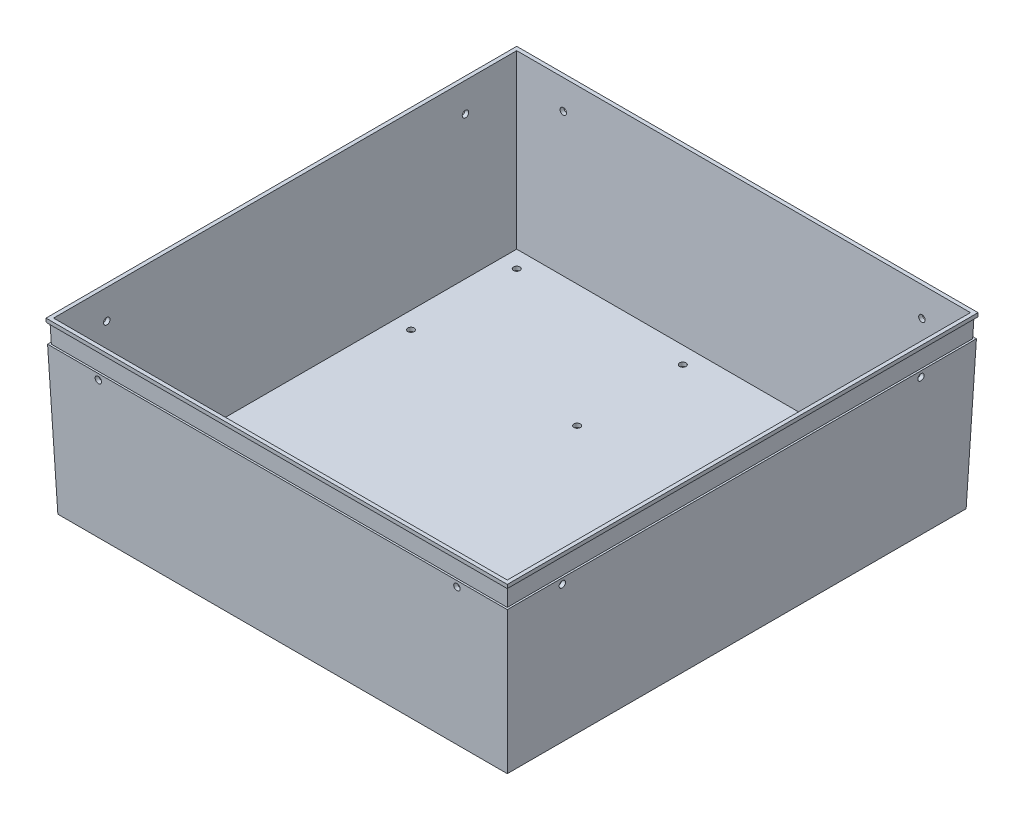
ISO-10303-21;
HEADER;
FILE_DESCRIPTION(('STEP AP214'),'2;1');
FILE_NAME('part.step','',(''),(''),'','','');
FILE_SCHEMA(('AUTOMOTIVE_DESIGN { 1 0 10303 214 1 1 1 1 }'));
ENDSEC;
DATA;
#1=APPLICATION_CONTEXT('core data for automotive mechanical design processes');
#2=APPLICATION_PROTOCOL_DEFINITION('international standard','automotive_design',2000,#1);
#3=PRODUCT_CONTEXT('',#1,'mechanical');
#4=PRODUCT('Part','Part','',(#3));
#5=PRODUCT_RELATED_PRODUCT_CATEGORY('part','',(#4));
#6=PRODUCT_DEFINITION_FORMATION('','',#4);
#7=PRODUCT_DEFINITION_CONTEXT('part definition',#1,'design');
#8=PRODUCT_DEFINITION('design','',#6,#7);
#9=PRODUCT_DEFINITION_SHAPE('','',#8);
#10=(LENGTH_UNIT() NAMED_UNIT(*) SI_UNIT(.MILLI.,.METRE.));
#11=(NAMED_UNIT(*) PLANE_ANGLE_UNIT() SI_UNIT($,.RADIAN.));
#12=(NAMED_UNIT(*) SI_UNIT($,.STERADIAN.) SOLID_ANGLE_UNIT());
#13=UNCERTAINTY_MEASURE_WITH_UNIT(LENGTH_MEASURE(1.E-05),#10,'distance_accuracy_value','');
#14=(GEOMETRIC_REPRESENTATION_CONTEXT(3) GLOBAL_UNCERTAINTY_ASSIGNED_CONTEXT((#13)) GLOBAL_UNIT_ASSIGNED_CONTEXT((#10,
#11,#12)) REPRESENTATION_CONTEXT('',''));
#15=CARTESIAN_POINT('',(0.,0.,0.));
#16=DIRECTION('',(0.,0.,1.));
#17=DIRECTION('',(1.,0.,0.));
#18=AXIS2_PLACEMENT_3D('',#15,#16,#17);
#19=CARTESIAN_POINT('',(-119.05,0.,-121.55));
#20=DIRECTION('',(0.,-0.034899496702501,-0.999390827019096));
#21=DIRECTION('',(0.,0.999390827019096,-0.034899496702501));
#22=AXIS2_PLACEMENT_3D('',#19,#20,#21);
#23=PLANE('',#22);
#24=DIRECTION('',(-0.0348782627423747,-0.998782765958718,0.0348782627423747));
#25=VECTOR('',#24,1.);
#26=CARTESIAN_POINT('',(118.76035296624,-8.29440582138538,-121.26035296624));
#27=LINE('',#26,#25);
#28=CARTESIAN_POINT('',(122.192869254257,90.,-124.692869254257));
#29=VERTEX_POINT('',#28);
#30=CARTESIAN_POINT('',(122.123070260852,88.0012183459618,-124.623070260852));
#31=VERTEX_POINT('',#30);
#32=EDGE_CURVE('E261',#29,#31,#27,.T.);
#33=ORIENTED_EDGE('',*,*,#32,.T.);
#34=DIRECTION('',(1.,0.,0.));
#35=VECTOR('',#34,1.);
#36=CARTESIAN_POINT('',(-119.05,88.0012183459618,-124.623070260852));
#37=LINE('',#36,#35);
#38=CARTESIAN_POINT('',(-122.123070260852,88.0012183459618,-124.623070260852));
#39=VERTEX_POINT('',#38);
#40=EDGE_CURVE('E198',#31,#39,#37,.F.);
#41=ORIENTED_EDGE('',*,*,#40,.T.);
#42=DIRECTION('',(0.0348782627423747,-0.998782765958718,0.0348782627423747));
#43=VECTOR('',#42,1.);
#44=CARTESIAN_POINT('',(-118.754270500181,-8.4685848600537,-121.254270500181));
#45=LINE('',#44,#43);
#46=CARTESIAN_POINT('',(-122.192869254257,90.,-124.692869254257));
#47=VERTEX_POINT('',#46);
#48=EDGE_CURVE('E277',#47,#39,#45,.T.);
#49=ORIENTED_EDGE('',*,*,#48,.F.);
#50=DIRECTION('',(1.,0.,0.));
#51=VECTOR('',#50,1.);
#52=CARTESIAN_POINT('',(0.,90.,-124.692869254257));
#53=LINE('',#52,#51);
#54=EDGE_CURVE('E284',#29,#47,#53,.F.);
#55=ORIENTED_EDGE('',*,*,#54,.F.);
#56=EDGE_LOOP('',(#33,#41,#49,#55));
#57=FACE_BOUND('',#56,.T.);
#58=ADVANCED_FACE('F45',(#57),#23,.T.);
#59=CARTESIAN_POINT('',(-95.,74.9393386013086,-124.16693936916));
#60=DIRECTION('',(0.,0.0348994967025011,0.999390827019096));
#61=DIRECTION('',(0.,-0.999390827019096,0.0348994967025011));
#62=AXIS2_PLACEMENT_3D('',#59,#60,#61);
#63=CIRCLE('',#62,1.7);
#64=CARTESIAN_POINT('',(-95.,73.2403741953761,-124.107610224766));
#65=VERTEX_POINT('',#64);
#66=EDGE_CURVE('E308',#65,#65,#63,.T.);
#67=ORIENTED_EDGE('',*,*,#66,.T.);
#68=EDGE_LOOP('',(#67));
#69=FACE_BOUND('',#68,.T.);
#70=CARTESIAN_POINT('',(95.,74.9393386013086,-124.16693936916));
#71=DIRECTION('',(0.,0.0348994967025011,0.999390827019096));
#72=DIRECTION('',(0.,0.999390827019096,-0.0348994967025011));
#73=AXIS2_PLACEMENT_3D('',#70,#71,#72);
#74=CIRCLE('',#73,1.7);
#75=CARTESIAN_POINT('',(95.,76.638303007241,-124.226268513555));
#76=VERTEX_POINT('',#75);
#77=EDGE_CURVE('E321',#76,#76,#74,.T.);
#78=ORIENTED_EDGE('',*,*,#77,.T.);
#79=EDGE_LOOP('',(#78));
#80=FACE_BOUND('',#79,.T.);
#81=DIRECTION('',(-1.,0.,0.));
#82=VECTOR('',#81,1.);
#83=CARTESIAN_POINT('',(-119.05,78.0133906863746,-124.274287633429));
#84=LINE('',#83,#82);
#85=CARTESIAN_POINT('',(-121.774287633429,78.0133906863746,-124.274287633429));
#86=VERTEX_POINT('',#85);
#87=CARTESIAN_POINT('',(121.774287633429,78.0133906863746,-124.274287633429));
#88=VERTEX_POINT('',#87);
#89=EDGE_CURVE('E187',#86,#88,#84,.F.);
#90=ORIENTED_EDGE('',*,*,#89,.T.);
#91=CARTESIAN_POINT('',(119.05,0.,-121.55));
#92=VERTEX_POINT('',#91);
#93=EDGE_CURVE('E265',#88,#92,#27,.T.);
#94=ORIENTED_EDGE('',*,*,#93,.T.);
#95=DIRECTION('',(-1.,0.,0.));
#96=VECTOR('',#95,1.);
#97=CARTESIAN_POINT('',(-119.05,0.,-121.55));
#98=LINE('',#97,#96);
#99=CARTESIAN_POINT('',(-119.05,0.,-121.55));
#100=VERTEX_POINT('',#99);
#101=EDGE_CURVE('E248',#92,#100,#98,.T.);
#102=ORIENTED_EDGE('',*,*,#101,.T.);
#103=EDGE_CURVE('E276',#86,#100,#45,.T.);
#104=ORIENTED_EDGE('',*,*,#103,.F.);
#105=EDGE_LOOP('',(#90,#94,#102,#104));
#106=FACE_BOUND('',#105,.T.);
#107=ADVANCED_FACE('F406',(#69,#80,#106),#23,.T.);
#108=CARTESIAN_POINT('',(-120.773678831314,78.0133906863746,-125.041651881681));
#109=DIRECTION('',(0.999390827019096,0.0348994967025021,0.));
#110=DIRECTION('',(-0.0348994967025021,0.999390827019096,0.));
#111=AXIS2_PLACEMENT_3D('',#108,#109,#110);
#112=PLANE('',#111);
#113=DIRECTION('',(-0.0348782627423758,0.998782765958718,-0.0348782627423758));
#114=VECTOR('',#113,1.);
#115=CARTESIAN_POINT('',(-120.775827335364,78.0749157925528,-123.277654853855));
#116=LINE('',#115,#114);
#117=CARTESIAN_POINT('',(-120.773678831314,78.0133906863746,-123.275506349804));
#118=VERTEX_POINT('',#117);
#119=CARTESIAN_POINT('',(-121.122461458737,88.0012183459618,-123.624288977228));
#120=VERTEX_POINT('',#119);
#121=EDGE_CURVE('E161',#118,#120,#116,.T.);
#122=ORIENTED_EDGE('',*,*,#121,.F.);
#123=DIRECTION('',(0.,0.,1.));
#124=VECTOR('',#123,1.);
#125=CARTESIAN_POINT('',(-120.773678831314,78.0133906863746,-125.041651881681));
#126=LINE('',#125,#124);
#127=CARTESIAN_POINT('',(-120.773678831314,78.0133906863746,123.275506349804));
#128=VERTEX_POINT('',#127);
#129=EDGE_CURVE('E172',#118,#128,#126,.T.);
#130=ORIENTED_EDGE('',*,*,#129,.T.);
#131=DIRECTION('',(-0.0348782627423758,0.998782765958718,0.0348782627423758));
#132=VECTOR('',#131,1.);
#133=CARTESIAN_POINT('',(-120.47160269392,69.3630619052526,122.973430212411));
#134=LINE('',#133,#132);
#135=CARTESIAN_POINT('',(-121.122461458737,88.0012183459618,123.624288977228));
#136=VERTEX_POINT('',#135);
#137=EDGE_CURVE('E372',#128,#136,#134,.T.);
#138=ORIENTED_EDGE('',*,*,#137,.T.);
#139=DIRECTION('',(0.,0.,1.));
#140=VECTOR('',#139,1.);
#141=CARTESIAN_POINT('',(-121.122461458737,88.0012183459618,-124.692869254257));
#142=LINE('',#141,#140);
#143=EDGE_CURVE('E174',#120,#136,#142,.T.);
#144=ORIENTED_EDGE('',*,*,#143,.F.);
#145=EDGE_LOOP('',(#122,#130,#138,#144));
#146=FACE_BOUND('',#145,.T.);
#147=ADVANCED_FACE('F170',(#146),#112,.F.);
#148=CARTESIAN_POINT('',(120.773678831314,78.0133906863746,-125.041651881681));
#149=DIRECTION('',(0.999390827019096,-0.0348994967025021,0.));
#150=DIRECTION('',(0.0348994967025021,0.999390827019096,0.));
#151=AXIS2_PLACEMENT_3D('',#148,#149,#150);
#152=PLANE('',#151);
#153=DIRECTION('',(0.,0.,1.));
#154=VECTOR('',#153,1.);
#155=CARTESIAN_POINT('',(120.773678831314,78.0133906863746,-125.041651881681));
#156=LINE('',#155,#154);
#157=CARTESIAN_POINT('',(120.773678831314,78.0133906863746,-123.275506349804));
#158=VERTEX_POINT('',#157);
#159=CARTESIAN_POINT('',(120.773678831314,78.0133906863746,123.275506349804));
#160=VERTEX_POINT('',#159);
#161=EDGE_CURVE('E364',#158,#160,#156,.T.);
#162=ORIENTED_EDGE('',*,*,#161,.F.);
#163=DIRECTION('',(0.0348782627423758,0.998782765958718,-0.0348782627423758));
#164=VECTOR('',#163,1.);
#165=CARTESIAN_POINT('',(120.775827335364,78.0749157925528,-123.277654853855));
#166=LINE('',#165,#164);
#167=CARTESIAN_POINT('',(121.122461458737,88.0012183459618,-123.624288977228));
#168=VERTEX_POINT('',#167);
#169=EDGE_CURVE('E11',#158,#168,#166,.T.);
#170=ORIENTED_EDGE('',*,*,#169,.T.);
#171=DIRECTION('',(0.,0.,1.));
#172=VECTOR('',#171,1.);
#173=CARTESIAN_POINT('',(121.122461458737,88.0012183459618,-124.692869254257));
#174=LINE('',#173,#172);
#175=CARTESIAN_POINT('',(121.122461458737,88.0012183459618,123.624288977228));
#176=VERTEX_POINT('',#175);
#177=EDGE_CURVE('E69',#168,#176,#174,.T.);
#178=ORIENTED_EDGE('',*,*,#177,.T.);
#179=DIRECTION('',(-0.0348782627423758,-0.998782765958718,-0.0348782627423758));
#180=VECTOR('',#179,1.);
#181=CARTESIAN_POINT('',(121.123763602555,88.0385068661232,123.625591121045));
#182=LINE('',#181,#180);
#183=EDGE_CURVE('E54',#176,#160,#182,.T.);
#184=ORIENTED_EDGE('',*,*,#183,.T.);
#185=EDGE_LOOP('',(#162,#170,#178,#184));
#186=FACE_BOUND('',#185,.T.);
#187=ADVANCED_FACE('F424',(#186),#152,.T.);
#188=CARTESIAN_POINT('',(119.05,0.,121.55));
#189=DIRECTION('',(0.999390827019096,-0.034899496702501,0.));
#190=DIRECTION('',(0.034899496702501,0.999390827019096,0.));
#191=AXIS2_PLACEMENT_3D('',#188,#189,#190);
#192=PLANE('',#191);
#193=DIRECTION('',(0.,0.,1.));
#194=VECTOR('',#193,1.);
#195=CARTESIAN_POINT('',(122.123070260852,88.0012183459618,121.55));
#196=LINE('',#195,#194);
#197=CARTESIAN_POINT('',(122.123070260852,88.0012183459618,124.623070260852));
#198=VERTEX_POINT('',#197);
#199=EDGE_CURVE('E378',#198,#31,#196,.F.);
#200=ORIENTED_EDGE('',*,*,#199,.T.);
#201=ORIENTED_EDGE('',*,*,#32,.F.);
#202=DIRECTION('',(0.,0.,1.));
#203=VECTOR('',#202,1.);
#204=CARTESIAN_POINT('',(122.192869254257,90.,0.));
#205=LINE('',#204,#203);
#206=CARTESIAN_POINT('',(122.192869254257,90.,124.692869254257));
#207=VERTEX_POINT('',#206);
#208=EDGE_CURVE('E260',#207,#29,#205,.F.);
#209=ORIENTED_EDGE('',*,*,#208,.F.);
#210=DIRECTION('',(-0.0348782627423747,-0.998782765958718,-0.0348782627423747));
#211=VECTOR('',#210,1.);
#212=CARTESIAN_POINT('',(119.05,0.,121.55));
#213=LINE('',#212,#211);
#214=EDGE_CURVE('E266',#207,#198,#213,.T.);
#215=ORIENTED_EDGE('',*,*,#214,.T.);
#216=EDGE_LOOP('',(#200,#201,#209,#215));
#217=FACE_BOUND('',#216,.T.);
#218=ADVANCED_FACE('F414',(#217),#192,.T.);
#219=CARTESIAN_POINT('',(121.66693936916,74.9393386013086,-95.));
#220=DIRECTION('',(-0.999390827019096,0.0348994967025011,0.));
#221=DIRECTION('',(-0.0348994967025011,-0.999390827019096,0.));
#222=AXIS2_PLACEMENT_3D('',#219,#220,#221);
#223=CIRCLE('',#222,1.7);
#224=CARTESIAN_POINT('',(121.607610224766,73.2403741953761,-95.));
#225=VERTEX_POINT('',#224);
#226=EDGE_CURVE('E325',#225,#225,#223,.T.);
#227=ORIENTED_EDGE('',*,*,#226,.T.);
#228=EDGE_LOOP('',(#227));
#229=FACE_BOUND('',#228,.T.);
#230=CARTESIAN_POINT('',(121.66693936916,74.9393386013086,95.));
#231=DIRECTION('',(-0.999390827019096,0.0348994967025011,0.));
#232=DIRECTION('',(0.0348994967025011,0.999390827019096,0.));
#233=AXIS2_PLACEMENT_3D('',#230,#231,#232);
#234=CIRCLE('',#233,1.7);
#235=CARTESIAN_POINT('',(121.726268513555,76.638303007241,95.));
#236=VERTEX_POINT('',#235);
#237=EDGE_CURVE('E333',#236,#236,#234,.T.);
#238=ORIENTED_EDGE('',*,*,#237,.T.);
#239=EDGE_LOOP('',(#238));
#240=FACE_BOUND('',#239,.T.);
#241=ORIENTED_EDGE('',*,*,#93,.F.);
#242=DIRECTION('',(0.,0.,-1.));
#243=VECTOR('',#242,1.);
#244=CARTESIAN_POINT('',(121.774287633429,78.0133906863746,121.55));
#245=LINE('',#244,#243);
#246=CARTESIAN_POINT('',(121.774287633429,78.0133906863746,124.274287633429));
#247=VERTEX_POINT('',#246);
#248=EDGE_CURVE('E381',#88,#247,#245,.F.);
#249=ORIENTED_EDGE('',*,*,#248,.T.);
#250=CARTESIAN_POINT('',(119.05,0.,121.55));
#251=VERTEX_POINT('',#250);
#252=EDGE_CURVE('E271',#247,#251,#213,.T.);
#253=ORIENTED_EDGE('',*,*,#252,.T.);
#254=DIRECTION('',(0.,0.,-1.));
#255=VECTOR('',#254,1.);
#256=CARTESIAN_POINT('',(119.05,0.,121.55));
#257=LINE('',#256,#255);
#258=EDGE_CURVE('E211',#251,#92,#257,.T.);
#259=ORIENTED_EDGE('',*,*,#258,.T.);
#260=EDGE_LOOP('',(#241,#249,#253,#259));
#261=FACE_BOUND('',#260,.T.);
#262=ADVANCED_FACE('F411',(#229,#240,#261),#192,.T.);
#263=CARTESIAN_POINT('',(122.192869254257,88.0012183459618,123.624288977228));
#264=DIRECTION('',(0.,0.0348994967025021,-0.999390827019096));
#265=DIRECTION('',(0.,0.999390827019096,0.0348994967025021));
#266=AXIS2_PLACEMENT_3D('',#263,#264,#265);
#267=PLANE('',#266);
#268=ORIENTED_EDGE('',*,*,#183,.F.);
#269=DIRECTION('',(-1.,0.,0.));
#270=VECTOR('',#269,1.);
#271=CARTESIAN_POINT('',(122.192869254257,88.0012183459618,123.624288977228));
#272=LINE('',#271,#270);
#273=EDGE_CURVE('E367',#176,#136,#272,.T.);
#274=ORIENTED_EDGE('',*,*,#273,.T.);
#275=ORIENTED_EDGE('',*,*,#137,.F.);
#276=DIRECTION('',(-1.,0.,0.));
#277=VECTOR('',#276,1.);
#278=CARTESIAN_POINT('',(122.541651881681,78.0133906863746,123.275506349804));
#279=LINE('',#278,#277);
#280=EDGE_CURVE('E180',#160,#128,#279,.T.);
#281=ORIENTED_EDGE('',*,*,#280,.F.);
#282=EDGE_LOOP('',(#268,#274,#275,#281));
#283=FACE_BOUND('',#282,.T.);
#284=ADVANCED_FACE('F413',(#283),#267,.F.);
#285=CARTESIAN_POINT('',(-119.05,0.,121.55));
#286=DIRECTION('',(0.,-0.034899496702501,0.999390827019096));
#287=DIRECTION('',(0.,-0.999390827019096,-0.034899496702501));
#288=AXIS2_PLACEMENT_3D('',#285,#286,#287);
#289=PLANE('',#288);
#290=CARTESIAN_POINT('',(-95.,74.9393386013086,124.16693936916));
#291=DIRECTION('',(0.,-0.0348994967025011,0.999390827019096));
#292=DIRECTION('',(0.,-0.999390827019096,-0.0348994967025011));
#293=AXIS2_PLACEMENT_3D('',#290,#291,#292);
#294=CIRCLE('',#293,1.7);
#295=CARTESIAN_POINT('',(-95.,73.2403741953761,124.107610224766));
#296=VERTEX_POINT('',#295);
#297=EDGE_CURVE('E299',#296,#296,#294,.T.);
#298=ORIENTED_EDGE('',*,*,#297,.F.);
#299=EDGE_LOOP('',(#298));
#300=FACE_BOUND('',#299,.T.);
#301=CARTESIAN_POINT('',(95.,74.9393386013086,124.16693936916));
#302=DIRECTION('',(0.,-0.0348994967025011,0.999390827019096));
#303=DIRECTION('',(0.,0.999390827019096,0.0348994967025011));
#304=AXIS2_PLACEMENT_3D('',#301,#302,#303);
#305=CIRCLE('',#304,1.7);
#306=CARTESIAN_POINT('',(95.,76.638303007241,124.226268513555));
#307=VERTEX_POINT('',#306);
#308=EDGE_CURVE('E312',#307,#307,#305,.T.);
#309=ORIENTED_EDGE('',*,*,#308,.F.);
#310=EDGE_LOOP('',(#309));
#311=FACE_BOUND('',#310,.T.);
#312=ORIENTED_EDGE('',*,*,#252,.F.);
#313=DIRECTION('',(1.,0.,0.));
#314=VECTOR('',#313,1.);
#315=CARTESIAN_POINT('',(-121.774287633429,78.0133906863746,124.274287633429));
#316=LINE('',#315,#314);
#317=CARTESIAN_POINT('',(-121.774287633429,78.0133906863746,124.274287633429));
#318=VERTEX_POINT('',#317);
#319=EDGE_CURVE('E195',#318,#247,#316,.T.);
#320=ORIENTED_EDGE('',*,*,#319,.F.);
#321=DIRECTION('',(0.0348782627423747,-0.998782765958718,-0.0348782627423747));
#322=VECTOR('',#321,1.);
#323=CARTESIAN_POINT('',(-119.05,0.,121.55));
#324=LINE('',#323,#322);
#325=CARTESIAN_POINT('',(-119.05,0.,121.55));
#326=VERTEX_POINT('',#325);
#327=EDGE_CURVE('E270',#318,#326,#324,.T.);
#328=ORIENTED_EDGE('',*,*,#327,.T.);
#329=DIRECTION('',(1.,0.,0.));
#330=VECTOR('',#329,1.);
#331=CARTESIAN_POINT('',(-119.05,0.,121.55));
#332=LINE('',#331,#330);
#333=EDGE_CURVE('E256',#326,#251,#332,.T.);
#334=ORIENTED_EDGE('',*,*,#333,.T.);
#335=EDGE_LOOP('',(#312,#320,#328,#334));
#336=FACE_BOUND('',#335,.T.);
#337=ADVANCED_FACE('F396',(#300,#311,#336),#289,.T.);
#338=CARTESIAN_POINT('',(-119.05,0.,121.55));
#339=DIRECTION('',(-0.999390827019096,-0.034899496702501,0.));
#340=DIRECTION('',(0.034899496702501,-0.999390827019096,0.));
#341=AXIS2_PLACEMENT_3D('',#338,#339,#340);
#342=PLANE('',#341);
#343=ORIENTED_EDGE('',*,*,#48,.T.);
#344=DIRECTION('',(0.,0.,1.));
#345=VECTOR('',#344,1.);
#346=CARTESIAN_POINT('',(-122.123070260852,88.0012183459618,-124.692869254257));
#347=LINE('',#346,#345);
#348=CARTESIAN_POINT('',(-122.123070260852,88.0012183459618,124.623070260852));
#349=VERTEX_POINT('',#348);
#350=EDGE_CURVE('E189',#39,#349,#347,.T.);
#351=ORIENTED_EDGE('',*,*,#350,.T.);
#352=CARTESIAN_POINT('',(-122.192869254257,90.,124.692869254257));
#353=VERTEX_POINT('',#352);
#354=EDGE_CURVE('E272',#353,#349,#324,.T.);
#355=ORIENTED_EDGE('',*,*,#354,.F.);
#356=DIRECTION('',(0.,0.,-1.));
#357=VECTOR('',#356,1.);
#358=CARTESIAN_POINT('',(-122.192869254257,90.,0.));
#359=LINE('',#358,#357);
#360=EDGE_CURVE('E287',#47,#353,#359,.F.);
#361=ORIENTED_EDGE('',*,*,#360,.F.);
#362=EDGE_LOOP('',(#343,#351,#355,#361));
#363=FACE_BOUND('',#362,.T.);
#364=ADVANCED_FACE('F447',(#363),#342,.T.);
#365=CARTESIAN_POINT('',(0.,90.,0.));
#366=DIRECTION('',(0.,-1.,0.));
#367=DIRECTION('',(0.,0.,-1.));
#368=AXIS2_PLACEMENT_3D('',#365,#366,#367);
#369=PLANE('',#368);
#370=ORIENTED_EDGE('',*,*,#208,.T.);
#371=ORIENTED_EDGE('',*,*,#54,.T.);
#372=ORIENTED_EDGE('',*,*,#360,.T.);
#373=DIRECTION('',(-1.,0.,0.));
#374=VECTOR('',#373,1.);
#375=CARTESIAN_POINT('',(0.,90.,124.692869254257));
#376=LINE('',#375,#374);
#377=EDGE_CURVE('E290',#353,#207,#376,.F.);
#378=ORIENTED_EDGE('',*,*,#377,.T.);
#379=EDGE_LOOP('',(#370,#371,#372,#378));
#380=FACE_BOUND('',#379,.T.);
#381=DIRECTION('',(0.,0.,1.));
#382=VECTOR('',#381,1.);
#383=CARTESIAN_POINT('',(120.19165016566,90.,0.));
#384=LINE('',#383,#382);
#385=CARTESIAN_POINT('',(120.19165016566,90.,122.69165016566));
#386=VERTEX_POINT('',#385);
#387=CARTESIAN_POINT('',(120.19165016566,90.,-122.69165016566));
#388=VERTEX_POINT('',#387);
#389=EDGE_CURVE('E233',#386,#388,#384,.F.);
#390=ORIENTED_EDGE('',*,*,#389,.F.);
#391=DIRECTION('',(-1.,0.,0.));
#392=VECTOR('',#391,1.);
#393=CARTESIAN_POINT('',(0.,90.,122.69165016566));
#394=LINE('',#393,#392);
#395=CARTESIAN_POINT('',(-120.19165016566,90.,122.69165016566));
#396=VERTEX_POINT('',#395);
#397=EDGE_CURVE('E218',#396,#386,#394,.F.);
#398=ORIENTED_EDGE('',*,*,#397,.F.);
#399=DIRECTION('',(0.,0.,-1.));
#400=VECTOR('',#399,1.);
#401=CARTESIAN_POINT('',(-120.19165016566,90.,0.));
#402=LINE('',#401,#400);
#403=CARTESIAN_POINT('',(-120.19165016566,90.,-122.69165016566));
#404=VERTEX_POINT('',#403);
#405=EDGE_CURVE('E239',#404,#396,#402,.F.);
#406=ORIENTED_EDGE('',*,*,#405,.F.);
#407=DIRECTION('',(1.,0.,0.));
#408=VECTOR('',#407,1.);
#409=CARTESIAN_POINT('',(0.,90.,-122.69165016566));
#410=LINE('',#409,#408);
#411=EDGE_CURVE('E236',#388,#404,#410,.F.);
#412=ORIENTED_EDGE('',*,*,#411,.F.);
#413=EDGE_LOOP('',(#390,#398,#406,#412));
#414=FACE_BOUND('',#413,.T.);
#415=ADVANCED_FACE('F451',(#380,#414),#369,.F.);
#416=CARTESIAN_POINT('',(-121.66693936916,74.9393386013086,-95.));
#417=DIRECTION('',(-0.999390827019096,-0.0348994967025011,0.));
#418=DIRECTION('',(0.0348994967025011,-0.999390827019096,0.));
#419=AXIS2_PLACEMENT_3D('',#416,#417,#418);
#420=CIRCLE('',#419,1.7);
#421=CARTESIAN_POINT('',(-121.607610224766,73.2403741953761,-95.));
#422=VERTEX_POINT('',#421);
#423=EDGE_CURVE('E318',#422,#422,#420,.T.);
#424=ORIENTED_EDGE('',*,*,#423,.F.);
#425=EDGE_LOOP('',(#424));
#426=FACE_BOUND('',#425,.T.);
#427=CARTESIAN_POINT('',(-121.66693936916,74.9393386013086,95.));
#428=DIRECTION('',(-0.999390827019096,-0.0348994967025011,0.));
#429=DIRECTION('',(-0.0348994967025011,0.999390827019096,0.));
#430=AXIS2_PLACEMENT_3D('',#427,#428,#429);
#431=CIRCLE('',#430,1.7);
#432=CARTESIAN_POINT('',(-121.726268513555,76.638303007241,95.));
#433=VERTEX_POINT('',#432);
#434=EDGE_CURVE('E331',#433,#433,#431,.T.);
#435=ORIENTED_EDGE('',*,*,#434,.F.);
#436=EDGE_LOOP('',(#435));
#437=FACE_BOUND('',#436,.T.);
#438=ORIENTED_EDGE('',*,*,#327,.F.);
#439=DIRECTION('',(0.,0.,1.));
#440=VECTOR('',#439,1.);
#441=CARTESIAN_POINT('',(-121.774287633429,78.0133906863746,-125.041651881681));
#442=LINE('',#441,#440);
#443=EDGE_CURVE('E183',#86,#318,#442,.T.);
#444=ORIENTED_EDGE('',*,*,#443,.F.);
#445=ORIENTED_EDGE('',*,*,#103,.T.);
#446=DIRECTION('',(0.,0.,1.));
#447=VECTOR('',#446,1.);
#448=CARTESIAN_POINT('',(-119.05,0.,121.55));
#449=LINE('',#448,#447);
#450=EDGE_CURVE('E252',#100,#326,#449,.T.);
#451=ORIENTED_EDGE('',*,*,#450,.T.);
#452=EDGE_LOOP('',(#438,#444,#445,#451));
#453=FACE_BOUND('',#452,.T.);
#454=ADVANCED_FACE('F455',(#426,#437,#453),#342,.T.);
#455=DIRECTION('',(-1.,0.,0.));
#456=VECTOR('',#455,1.);
#457=CARTESIAN_POINT('',(-121.122461458737,88.0012183459618,124.623070260852));
#458=LINE('',#457,#456);
#459=EDGE_CURVE('E384',#198,#349,#458,.T.);
#460=ORIENTED_EDGE('',*,*,#459,.F.);
#461=ORIENTED_EDGE('',*,*,#214,.F.);
#462=ORIENTED_EDGE('',*,*,#377,.F.);
#463=ORIENTED_EDGE('',*,*,#354,.T.);
#464=EDGE_LOOP('',(#460,#461,#462,#463));
#465=FACE_BOUND('',#464,.T.);
#466=ADVANCED_FACE('F454',(#465),#289,.T.);
#467=CARTESIAN_POINT('',(0.,0.,0.));
#468=DIRECTION('',(0.,-1.,0.));
#469=DIRECTION('',(0.,0.,-1.));
#470=AXIS2_PLACEMENT_3D('',#467,#468,#469);
#471=PLANE('',#470);
#472=CARTESIAN_POINT('',(-108.118622450386,0.,-110.618622450386));
#473=DIRECTION('',(0.,1.,0.));
#474=DIRECTION('',(0.,0.,1.));
#475=AXIS2_PLACEMENT_3D('',#472,#473,#474);
#476=CIRCLE('',#475,1.69999999999999);
#477=CARTESIAN_POINT('',(-108.118622450386,0.,-108.918622450386));
#478=VERTEX_POINT('',#477);
#479=EDGE_CURVE('E760',#478,#478,#476,.T.);
#480=ORIENTED_EDGE('',*,*,#479,.T.);
#481=EDGE_LOOP('',(#480));
#482=FACE_BOUND('',#481,.T.);
#483=CARTESIAN_POINT('',(-20.1186224503859,0.,-110.618622450386));
#484=DIRECTION('',(0.,1.,0.));
#485=DIRECTION('',(0.,0.,1.));
#486=AXIS2_PLACEMENT_3D('',#483,#484,#485);
#487=CIRCLE('',#486,1.69999999999999);
#488=CARTESIAN_POINT('',(-20.1186224503859,0.,-108.918622450386));
#489=VERTEX_POINT('',#488);
#490=EDGE_CURVE('E773',#489,#489,#487,.T.);
#491=ORIENTED_EDGE('',*,*,#490,.T.);
#492=EDGE_LOOP('',(#491));
#493=FACE_BOUND('',#492,.T.);
#494=CARTESIAN_POINT('',(-20.1186224503859,0.,-54.6186224503857));
#495=DIRECTION('',(0.,1.,0.));
#496=DIRECTION('',(0.,0.,1.));
#497=AXIS2_PLACEMENT_3D('',#494,#495,#496);
#498=CIRCLE('',#497,1.69999999999999);
#499=CARTESIAN_POINT('',(-20.1186224503859,0.,-52.9186224503857));
#500=VERTEX_POINT('',#499);
#501=EDGE_CURVE('E781',#500,#500,#498,.T.);
#502=ORIENTED_EDGE('',*,*,#501,.T.);
#503=EDGE_LOOP('',(#502));
#504=FACE_BOUND('',#503,.T.);
#505=CARTESIAN_POINT('',(-108.118622450386,0.,-54.6186224503857));
#506=DIRECTION('',(0.,1.,0.));
#507=DIRECTION('',(0.,0.,1.));
#508=AXIS2_PLACEMENT_3D('',#505,#506,#507);
#509=CIRCLE('',#508,1.69999999999999);
#510=CARTESIAN_POINT('',(-108.118622450386,0.,-52.9186224503857));
#511=VERTEX_POINT('',#510);
#512=EDGE_CURVE('E339',#511,#511,#509,.T.);
#513=ORIENTED_EDGE('',*,*,#512,.T.);
#514=EDGE_LOOP('',(#513));
#515=FACE_BOUND('',#514,.T.);
#516=ORIENTED_EDGE('',*,*,#258,.F.);
#517=ORIENTED_EDGE('',*,*,#333,.F.);
#518=ORIENTED_EDGE('',*,*,#450,.F.);
#519=ORIENTED_EDGE('',*,*,#101,.F.);
#520=EDGE_LOOP('',(#516,#517,#518,#519));
#521=FACE_BOUND('',#520,.T.);
#522=ADVANCED_FACE('F410',(#482,#493,#504,#515,#521),#471,.T.);
#523=CARTESIAN_POINT('',(117.051218345962,0.0697989934050021,121.55));
#524=DIRECTION('',(0.999390827019096,-0.034899496702501,0.));
#525=DIRECTION('',(0.034899496702501,0.999390827019096,0.));
#526=AXIS2_PLACEMENT_3D('',#523,#524,#525);
#527=PLANE('',#526);
#528=CARTESIAN_POINT('',(119.668157715122,75.0091375947136,-95.));
#529=DIRECTION('',(0.999390827019096,-0.034899496702501,0.));
#530=DIRECTION('',(0.034899496702501,0.999390827019096,0.));
#531=AXIS2_PLACEMENT_3D('',#528,#529,#530);
#532=CIRCLE('',#531,1.7);
#533=CARTESIAN_POINT('',(119.727486859516,76.708102000646,-95.));
#534=VERTEX_POINT('',#533);
#535=EDGE_CURVE('E48',#534,#534,#532,.T.);
#536=ORIENTED_EDGE('',*,*,#535,.T.);
#537=EDGE_LOOP('',(#536));
#538=FACE_BOUND('',#537,.T.);
#539=CARTESIAN_POINT('',(119.668157715122,75.0091375947136,95.));
#540=DIRECTION('',(0.999390827019096,-0.034899496702501,0.));
#541=DIRECTION('',(0.034899496702501,0.999390827019096,0.));
#542=AXIS2_PLACEMENT_3D('',#539,#540,#541);
#543=CIRCLE('',#542,1.7);
#544=CARTESIAN_POINT('',(119.727486859516,76.708102000646,95.));
#545=VERTEX_POINT('',#544);
#546=EDGE_CURVE('E322',#545,#545,#543,.T.);
#547=ORIENTED_EDGE('',*,*,#546,.T.);
#548=EDGE_LOOP('',(#547));
#549=FACE_BOUND('',#548,.T.);
#550=DIRECTION('',(0.,0.,1.));
#551=VECTOR('',#550,1.);
#552=CARTESIAN_POINT('',(117.118622450386,2.,0.));
#553=LINE('',#552,#551);
#554=CARTESIAN_POINT('',(117.118622450386,2.,119.618622450386));
#555=VERTEX_POINT('',#554);
#556=CARTESIAN_POINT('',(117.118622450386,2.,-119.618622450386));
#557=VERTEX_POINT('',#556);
#558=EDGE_CURVE('E202',#555,#557,#553,.F.);
#559=ORIENTED_EDGE('',*,*,#558,.F.);
#560=DIRECTION('',(-0.0348782627423747,-0.998782765958718,-0.0348782627423747));
#561=VECTOR('',#560,1.);
#562=CARTESIAN_POINT('',(117.053649850276,0.139428166806651,119.553649850276));
#563=LINE('',#562,#561);
#564=EDGE_CURVE('E213',#386,#555,#563,.T.);
#565=ORIENTED_EDGE('',*,*,#564,.F.);
#566=ORIENTED_EDGE('',*,*,#389,.T.);
#567=DIRECTION('',(-0.0348782627423747,-0.998782765958718,0.0348782627423747));
#568=VECTOR('',#567,1.);
#569=CARTESIAN_POINT('',(116.764002816516,-8.15497765457873,-119.264002816516));
#570=LINE('',#569,#568);
#571=EDGE_CURVE('E207',#388,#557,#570,.T.);
#572=ORIENTED_EDGE('',*,*,#571,.T.);
#573=EDGE_LOOP('',(#559,#565,#566,#572));
#574=FACE_BOUND('',#573,.T.);
#575=ADVANCED_FACE('F459',(#538,#549,#574),#527,.F.);
#576=CARTESIAN_POINT('',(-119.05,0.0697989934050021,-119.551218345962));
#577=DIRECTION('',(0.,-0.034899496702501,-0.999390827019096));
#578=DIRECTION('',(0.,0.999390827019096,-0.034899496702501));
#579=AXIS2_PLACEMENT_3D('',#576,#577,#578);
#580=PLANE('',#579);
#581=CARTESIAN_POINT('',(-95.,75.0091375947136,-122.168157715122));
#582=DIRECTION('',(0.,-0.034899496702501,-0.999390827019096));
#583=DIRECTION('',(0.,0.999390827019096,-0.034899496702501));
#584=AXIS2_PLACEMENT_3D('',#581,#582,#583);
#585=CIRCLE('',#584,1.7);
#586=CARTESIAN_POINT('',(-95.,76.708102000646,-122.227486859516));
#587=VERTEX_POINT('',#586);
#588=EDGE_CURVE('E307',#587,#587,#585,.T.);
#589=ORIENTED_EDGE('',*,*,#588,.T.);
#590=EDGE_LOOP('',(#589));
#591=FACE_BOUND('',#590,.T.);
#592=CARTESIAN_POINT('',(95.,75.0091375947136,-122.168157715122));
#593=DIRECTION('',(0.,-0.034899496702501,-0.999390827019096));
#594=DIRECTION('',(0.,0.999390827019096,-0.034899496702501));
#595=AXIS2_PLACEMENT_3D('',#592,#593,#594);
#596=CIRCLE('',#595,1.7);
#597=CARTESIAN_POINT('',(95.,76.708102000646,-122.227486859516));
#598=VERTEX_POINT('',#597);
#599=EDGE_CURVE('E303',#598,#598,#596,.T.);
#600=ORIENTED_EDGE('',*,*,#599,.T.);
#601=EDGE_LOOP('',(#600));
#602=FACE_BOUND('',#601,.T.);
#603=DIRECTION('',(1.,0.,0.));
#604=VECTOR('',#603,1.);
#605=CARTESIAN_POINT('',(0.,2.,-119.618622450386));
#606=LINE('',#605,#604);
#607=CARTESIAN_POINT('',(-117.118622450386,2.,-119.618622450386));
#608=VERTEX_POINT('',#607);
#609=EDGE_CURVE('E206',#557,#608,#606,.F.);
#610=ORIENTED_EDGE('',*,*,#609,.F.);
#611=ORIENTED_EDGE('',*,*,#571,.F.);
#612=ORIENTED_EDGE('',*,*,#411,.T.);
#613=DIRECTION('',(0.0348782627423747,-0.998782765958718,0.0348782627423747));
#614=VECTOR('',#613,1.);
#615=CARTESIAN_POINT('',(-116.757920350457,-8.32915669324704,-119.257920350457));
#616=LINE('',#615,#614);
#617=EDGE_CURVE('E212',#404,#608,#616,.T.);
#618=ORIENTED_EDGE('',*,*,#617,.T.);
#619=EDGE_LOOP('',(#610,#611,#612,#618));
#620=FACE_BOUND('',#619,.T.);
#621=ADVANCED_FACE('F498',(#591,#602,#620),#580,.F.);
#622=CARTESIAN_POINT('',(-117.051218345962,0.0697989934050021,121.55));
#623=DIRECTION('',(-0.999390827019096,-0.034899496702501,0.));
#624=DIRECTION('',(0.034899496702501,-0.999390827019096,0.));
#625=AXIS2_PLACEMENT_3D('',#622,#623,#624);
#626=PLANE('',#625);
#627=CARTESIAN_POINT('',(-119.668157715122,75.0091375947136,-95.));
#628=DIRECTION('',(-0.999390827019096,-0.034899496702501,0.));
#629=DIRECTION('',(0.034899496702501,-0.999390827019096,0.));
#630=AXIS2_PLACEMENT_3D('',#627,#628,#629);
#631=CIRCLE('',#630,1.7);
#632=CARTESIAN_POINT('',(-119.608828570728,73.3101731887811,-95.));
#633=VERTEX_POINT('',#632);
#634=EDGE_CURVE('E317',#633,#633,#631,.F.);
#635=ORIENTED_EDGE('',*,*,#634,.F.);
#636=EDGE_LOOP('',(#635));
#637=FACE_BOUND('',#636,.T.);
#638=CARTESIAN_POINT('',(-119.668157715122,75.0091375947136,95.));
#639=DIRECTION('',(-0.999390827019096,-0.034899496702501,0.));
#640=DIRECTION('',(0.034899496702501,-0.999390827019096,0.));
#641=AXIS2_PLACEMENT_3D('',#638,#639,#640);
#642=CIRCLE('',#641,1.7);
#643=CARTESIAN_POINT('',(-119.608828570728,73.3101731887811,95.));
#644=VERTEX_POINT('',#643);
#645=EDGE_CURVE('E313',#644,#644,#642,.F.);
#646=ORIENTED_EDGE('',*,*,#645,.F.);
#647=EDGE_LOOP('',(#646));
#648=FACE_BOUND('',#647,.T.);
#649=DIRECTION('',(0.,0.,-1.));
#650=VECTOR('',#649,1.);
#651=CARTESIAN_POINT('',(-117.118622450386,2.,0.));
#652=LINE('',#651,#650);
#653=CARTESIAN_POINT('',(-117.118622450386,2.,119.618622450386));
#654=VERTEX_POINT('',#653);
#655=EDGE_CURVE('E221',#608,#654,#652,.F.);
#656=ORIENTED_EDGE('',*,*,#655,.F.);
#657=ORIENTED_EDGE('',*,*,#617,.F.);
#658=ORIENTED_EDGE('',*,*,#405,.T.);
#659=DIRECTION('',(0.0348782627423747,-0.998782765958718,-0.0348782627423747));
#660=VECTOR('',#659,1.);
#661=CARTESIAN_POINT('',(-117.053649850276,0.139428166806651,119.553649850276));
#662=LINE('',#661,#660);
#663=EDGE_CURVE('E217',#396,#654,#662,.T.);
#664=ORIENTED_EDGE('',*,*,#663,.T.);
#665=EDGE_LOOP('',(#656,#657,#658,#664));
#666=FACE_BOUND('',#665,.T.);
#667=ADVANCED_FACE('F502',(#637,#648,#666),#626,.F.);
#668=CARTESIAN_POINT('',(-119.05,0.0697989934050021,119.551218345962));
#669=DIRECTION('',(0.,-0.034899496702501,0.999390827019096));
#670=DIRECTION('',(0.,-0.999390827019096,-0.034899496702501));
#671=AXIS2_PLACEMENT_3D('',#668,#669,#670);
#672=PLANE('',#671);
#673=CARTESIAN_POINT('',(-95.,75.0091375947136,122.168157715122));
#674=DIRECTION('',(0.,-0.034899496702501,0.999390827019096));
#675=DIRECTION('',(0.,-0.999390827019096,-0.034899496702501));
#676=AXIS2_PLACEMENT_3D('',#673,#674,#675);
#677=CIRCLE('',#676,1.7);
#678=CARTESIAN_POINT('',(-95.,73.3101731887811,122.108828570728));
#679=VERTEX_POINT('',#678);
#680=EDGE_CURVE('E166',#679,#679,#677,.F.);
#681=ORIENTED_EDGE('',*,*,#680,.F.);
#682=EDGE_LOOP('',(#681));
#683=FACE_BOUND('',#682,.T.);
#684=CARTESIAN_POINT('',(95.,75.0091375947136,122.168157715122));
#685=DIRECTION('',(0.,-0.034899496702501,0.999390827019096));
#686=DIRECTION('',(0.,-0.999390827019096,-0.034899496702501));
#687=AXIS2_PLACEMENT_3D('',#684,#685,#686);
#688=CIRCLE('',#687,1.7);
#689=CARTESIAN_POINT('',(95.,73.3101731887811,122.108828570728));
#690=VERTEX_POINT('',#689);
#691=EDGE_CURVE('E295',#690,#690,#688,.F.);
#692=ORIENTED_EDGE('',*,*,#691,.F.);
#693=EDGE_LOOP('',(#692));
#694=FACE_BOUND('',#693,.T.);
#695=DIRECTION('',(-1.,0.,0.));
#696=VECTOR('',#695,1.);
#697=CARTESIAN_POINT('',(0.,2.,119.618622450386));
#698=LINE('',#697,#696);
#699=EDGE_CURVE('E227',#654,#555,#698,.F.);
#700=ORIENTED_EDGE('',*,*,#699,.F.);
#701=ORIENTED_EDGE('',*,*,#663,.F.);
#702=ORIENTED_EDGE('',*,*,#397,.T.);
#703=ORIENTED_EDGE('',*,*,#564,.T.);
#704=EDGE_LOOP('',(#700,#701,#702,#703));
#705=FACE_BOUND('',#704,.T.);
#706=ADVANCED_FACE('F506',(#683,#694,#705),#672,.F.);
#707=CARTESIAN_POINT('',(0.,2.,0.));
#708=DIRECTION('',(0.,-1.,0.));
#709=DIRECTION('',(0.,0.,-1.));
#710=AXIS2_PLACEMENT_3D('',#707,#708,#709);
#711=PLANE('',#710);
#712=CARTESIAN_POINT('',(-108.118622450386,2.,-110.618622450386));
#713=DIRECTION('',(0.,1.,0.));
#714=DIRECTION('',(0.,0.,1.));
#715=AXIS2_PLACEMENT_3D('',#712,#713,#714);
#716=CIRCLE('',#715,1.69999999999999);
#717=CARTESIAN_POINT('',(-108.118622450386,2.,-108.918622450386));
#718=VERTEX_POINT('',#717);
#719=EDGE_CURVE('E763',#718,#718,#716,.T.);
#720=ORIENTED_EDGE('',*,*,#719,.F.);
#721=EDGE_LOOP('',(#720));
#722=FACE_BOUND('',#721,.T.);
#723=CARTESIAN_POINT('',(-20.1186224503859,2.,-110.618622450386));
#724=DIRECTION('',(0.,1.,0.));
#725=DIRECTION('',(0.,0.,1.));
#726=AXIS2_PLACEMENT_3D('',#723,#724,#725);
#727=CIRCLE('',#726,1.69999999999999);
#728=CARTESIAN_POINT('',(-20.1186224503859,2.,-108.918622450386));
#729=VERTEX_POINT('',#728);
#730=EDGE_CURVE('E767',#729,#729,#727,.T.);
#731=ORIENTED_EDGE('',*,*,#730,.F.);
#732=EDGE_LOOP('',(#731));
#733=FACE_BOUND('',#732,.T.);
#734=CARTESIAN_POINT('',(-20.1186224503859,2.,-54.6186224503857));
#735=DIRECTION('',(0.,1.,0.));
#736=DIRECTION('',(0.,0.,1.));
#737=AXIS2_PLACEMENT_3D('',#734,#735,#736);
#738=CIRCLE('',#737,1.69999999999999);
#739=CARTESIAN_POINT('',(-20.1186224503859,2.,-52.9186224503857));
#740=VERTEX_POINT('',#739);
#741=EDGE_CURVE('E777',#740,#740,#738,.T.);
#742=ORIENTED_EDGE('',*,*,#741,.F.);
#743=EDGE_LOOP('',(#742));
#744=FACE_BOUND('',#743,.T.);
#745=CARTESIAN_POINT('',(-108.118622450386,2.,-54.6186224503857));
#746=DIRECTION('',(0.,1.,0.));
#747=DIRECTION('',(0.,0.,1.));
#748=AXIS2_PLACEMENT_3D('',#745,#746,#747);
#749=CIRCLE('',#748,1.69999999999999);
#750=CARTESIAN_POINT('',(-108.118622450386,2.,-52.9186224503857));
#751=VERTEX_POINT('',#750);
#752=EDGE_CURVE('E784',#751,#751,#749,.T.);
#753=ORIENTED_EDGE('',*,*,#752,.F.);
#754=EDGE_LOOP('',(#753));
#755=FACE_BOUND('',#754,.T.);
#756=ORIENTED_EDGE('',*,*,#558,.T.);
#757=ORIENTED_EDGE('',*,*,#609,.T.);
#758=ORIENTED_EDGE('',*,*,#655,.T.);
#759=ORIENTED_EDGE('',*,*,#699,.T.);
#760=EDGE_LOOP('',(#756,#757,#758,#759));
#761=FACE_BOUND('',#760,.T.);
#762=ADVANCED_FACE('F495',(#722,#733,#744,#755,#761),#711,.F.);
#763=CARTESIAN_POINT('',(-121.122461458737,88.0012183459618,-124.692869254257));
#764=DIRECTION('',(0.,1.,0.));
#765=DIRECTION('',(0.,0.,1.));
#766=AXIS2_PLACEMENT_3D('',#763,#764,#765);
#767=PLANE('',#766);
#768=ORIENTED_EDGE('',*,*,#177,.F.);
#769=DIRECTION('',(-1.,0.,0.));
#770=VECTOR('',#769,1.);
#771=CARTESIAN_POINT('',(122.192869254257,88.0012183459618,-123.624288977228));
#772=LINE('',#771,#770);
#773=EDGE_CURVE('E165',#168,#120,#772,.T.);
#774=ORIENTED_EDGE('',*,*,#773,.T.);
#775=ORIENTED_EDGE('',*,*,#143,.T.);
#776=ORIENTED_EDGE('',*,*,#273,.F.);
#777=EDGE_LOOP('',(#768,#774,#775,#776));
#778=FACE_BOUND('',#777,.T.);
#779=ORIENTED_EDGE('',*,*,#40,.F.);
#780=ORIENTED_EDGE('',*,*,#199,.F.);
#781=ORIENTED_EDGE('',*,*,#459,.T.);
#782=ORIENTED_EDGE('',*,*,#350,.F.);
#783=EDGE_LOOP('',(#779,#780,#781,#782));
#784=FACE_BOUND('',#783,.T.);
#785=ADVANCED_FACE('F444',(#778,#784),#767,.F.);
#786=CARTESIAN_POINT('',(-121.774287633429,78.0133906863746,-125.041651881681));
#787=DIRECTION('',(0.,-1.,0.));
#788=DIRECTION('',(0.,0.,-1.));
#789=AXIS2_PLACEMENT_3D('',#786,#787,#788);
#790=PLANE('',#789);
#791=ORIENTED_EDGE('',*,*,#129,.F.);
#792=DIRECTION('',(-1.,0.,0.));
#793=VECTOR('',#792,1.);
#794=CARTESIAN_POINT('',(122.541651881681,78.0133906863746,-123.275506349804));
#795=LINE('',#794,#793);
#796=EDGE_CURVE('E62',#158,#118,#795,.T.);
#797=ORIENTED_EDGE('',*,*,#796,.F.);
#798=ORIENTED_EDGE('',*,*,#161,.T.);
#799=ORIENTED_EDGE('',*,*,#280,.T.);
#800=EDGE_LOOP('',(#791,#797,#798,#799));
#801=FACE_BOUND('',#800,.T.);
#802=ORIENTED_EDGE('',*,*,#248,.F.);
#803=ORIENTED_EDGE('',*,*,#89,.F.);
#804=ORIENTED_EDGE('',*,*,#443,.T.);
#805=ORIENTED_EDGE('',*,*,#319,.T.);
#806=EDGE_LOOP('',(#802,#803,#804,#805));
#807=FACE_BOUND('',#806,.T.);
#808=ADVANCED_FACE('F177',(#801,#807),#790,.F.);
#809=CARTESIAN_POINT('',(122.192869254257,88.0012183459618,-123.624288977228));
#810=DIRECTION('',(0.,-0.0348994967025021,-0.999390827019096));
#811=DIRECTION('',(0.,0.999390827019096,-0.0348994967025021));
#812=AXIS2_PLACEMENT_3D('',#809,#810,#811);
#813=PLANE('',#812);
#814=ORIENTED_EDGE('',*,*,#121,.T.);
#815=ORIENTED_EDGE('',*,*,#773,.F.);
#816=ORIENTED_EDGE('',*,*,#169,.F.);
#817=ORIENTED_EDGE('',*,*,#796,.T.);
#818=EDGE_LOOP('',(#814,#815,#816,#817));
#819=FACE_BOUND('',#818,.T.);
#820=ADVANCED_FACE('F160',(#819),#813,.T.);
#821=CARTESIAN_POINT('',(95.,75.0440370914161,121.168766888103));
#822=DIRECTION('',(0.,-0.0348994967025011,0.999390827019096));
#823=DIRECTION('',(0.,-0.999390827019096,-0.0348994967025011));
#824=AXIS2_PLACEMENT_3D('',#821,#822,#823);
#825=CYLINDRICAL_SURFACE('',#824,1.7);
#826=ORIENTED_EDGE('',*,*,#691,.T.);
#827=EDGE_LOOP('',(#826));
#828=FACE_BOUND('',#827,.T.);
#829=ORIENTED_EDGE('',*,*,#308,.T.);
#830=EDGE_LOOP('',(#829));
#831=FACE_BOUND('',#830,.T.);
#832=ADVANCED_FACE('F474',(#828,#831),#825,.F.);
#833=CARTESIAN_POINT('',(-95.,75.0440370914161,121.168766888103));
#834=DIRECTION('',(0.,-0.0348994967025011,0.999390827019096));
#835=DIRECTION('',(0.,-0.999390827019096,-0.0348994967025011));
#836=AXIS2_PLACEMENT_3D('',#833,#834,#835);
#837=CYLINDRICAL_SURFACE('',#836,1.7);
#838=ORIENTED_EDGE('',*,*,#680,.T.);
#839=EDGE_LOOP('',(#838));
#840=FACE_BOUND('',#839,.T.);
#841=ORIENTED_EDGE('',*,*,#297,.T.);
#842=EDGE_LOOP('',(#841));
#843=FACE_BOUND('',#842,.T.);
#844=ADVANCED_FACE('F476',(#840,#843),#837,.F.);
#845=CARTESIAN_POINT('',(95.,75.0440370914161,-121.168766888103));
#846=DIRECTION('',(0.,-0.0348994967025011,-0.999390827019096));
#847=DIRECTION('',(0.,0.999390827019096,-0.0348994967025011));
#848=AXIS2_PLACEMENT_3D('',#845,#846,#847);
#849=CYLINDRICAL_SURFACE('',#848,1.7);
#850=ORIENTED_EDGE('',*,*,#599,.F.);
#851=EDGE_LOOP('',(#850));
#852=FACE_BOUND('',#851,.T.);
#853=ORIENTED_EDGE('',*,*,#77,.F.);
#854=EDGE_LOOP('',(#853));
#855=FACE_BOUND('',#854,.T.);
#856=ADVANCED_FACE('F482',(#852,#855),#849,.F.);
#857=CARTESIAN_POINT('',(-95.,75.0440370914161,-121.168766888103));
#858=DIRECTION('',(0.,-0.0348994967025011,-0.999390827019096));
#859=DIRECTION('',(0.,0.999390827019096,-0.0348994967025011));
#860=AXIS2_PLACEMENT_3D('',#857,#858,#859);
#861=CYLINDRICAL_SURFACE('',#860,1.7);
#862=ORIENTED_EDGE('',*,*,#588,.F.);
#863=EDGE_LOOP('',(#862));
#864=FACE_BOUND('',#863,.T.);
#865=ORIENTED_EDGE('',*,*,#66,.F.);
#866=EDGE_LOOP('',(#865));
#867=FACE_BOUND('',#866,.T.);
#868=ADVANCED_FACE('F584',(#864,#867),#861,.F.);
#869=CARTESIAN_POINT('',(-118.668766888103,75.0440370914161,95.));
#870=DIRECTION('',(-0.999390827019096,-0.0348994967025011,0.));
#871=DIRECTION('',(0.0348994967025011,-0.999390827019096,0.));
#872=AXIS2_PLACEMENT_3D('',#869,#870,#871);
#873=CYLINDRICAL_SURFACE('',#872,1.7);
#874=ORIENTED_EDGE('',*,*,#645,.T.);
#875=EDGE_LOOP('',(#874));
#876=FACE_BOUND('',#875,.T.);
#877=ORIENTED_EDGE('',*,*,#434,.T.);
#878=EDGE_LOOP('',(#877));
#879=FACE_BOUND('',#878,.T.);
#880=ADVANCED_FACE('F592',(#876,#879),#873,.F.);
#881=CARTESIAN_POINT('',(-118.668766888103,75.0440370914161,-95.));
#882=DIRECTION('',(-0.999390827019096,-0.0348994967025011,0.));
#883=DIRECTION('',(0.0348994967025011,-0.999390827019096,0.));
#884=AXIS2_PLACEMENT_3D('',#881,#882,#883);
#885=CYLINDRICAL_SURFACE('',#884,1.7);
#886=ORIENTED_EDGE('',*,*,#634,.T.);
#887=EDGE_LOOP('',(#886));
#888=FACE_BOUND('',#887,.T.);
#889=ORIENTED_EDGE('',*,*,#423,.T.);
#890=EDGE_LOOP('',(#889));
#891=FACE_BOUND('',#890,.T.);
#892=ADVANCED_FACE('F601',(#888,#891),#885,.F.);
#893=CARTESIAN_POINT('',(118.668766888103,75.0440370914161,95.));
#894=DIRECTION('',(0.999390827019096,-0.0348994967025011,0.));
#895=DIRECTION('',(0.0348994967025011,0.999390827019096,0.));
#896=AXIS2_PLACEMENT_3D('',#893,#894,#895);
#897=CYLINDRICAL_SURFACE('',#896,1.7);
#898=ORIENTED_EDGE('',*,*,#546,.F.);
#899=EDGE_LOOP('',(#898));
#900=FACE_BOUND('',#899,.T.);
#901=ORIENTED_EDGE('',*,*,#237,.F.);
#902=EDGE_LOOP('',(#901));
#903=FACE_BOUND('',#902,.T.);
#904=ADVANCED_FACE('F609',(#900,#903),#897,.F.);
#905=CARTESIAN_POINT('',(118.668766888103,75.0440370914161,-95.));
#906=DIRECTION('',(0.999390827019096,-0.0348994967025011,0.));
#907=DIRECTION('',(0.0348994967025011,0.999390827019096,0.));
#908=AXIS2_PLACEMENT_3D('',#905,#906,#907);
#909=CYLINDRICAL_SURFACE('',#908,1.7);
#910=ORIENTED_EDGE('',*,*,#535,.F.);
#911=EDGE_LOOP('',(#910));
#912=FACE_BOUND('',#911,.T.);
#913=ORIENTED_EDGE('',*,*,#226,.F.);
#914=EDGE_LOOP('',(#913));
#915=FACE_BOUND('',#914,.T.);
#916=ADVANCED_FACE('F618',(#912,#915),#909,.F.);
#917=CARTESIAN_POINT('',(-108.118622450386,2.,-54.6186224503857));
#918=DIRECTION('',(0.,1.,0.));
#919=DIRECTION('',(0.,0.,1.));
#920=AXIS2_PLACEMENT_3D('',#917,#918,#919);
#921=CYLINDRICAL_SURFACE('',#920,1.69999999999999);
#922=ORIENTED_EDGE('',*,*,#512,.F.);
#923=EDGE_LOOP('',(#922));
#924=FACE_BOUND('',#923,.T.);
#925=ORIENTED_EDGE('',*,*,#752,.T.);
#926=EDGE_LOOP('',(#925));
#927=FACE_BOUND('',#926,.T.);
#928=ADVANCED_FACE('F627',(#924,#927),#921,.F.);
#929=CARTESIAN_POINT('',(-20.1186224503859,2.,-54.6186224503857));
#930=DIRECTION('',(0.,1.,0.));
#931=DIRECTION('',(0.,0.,1.));
#932=AXIS2_PLACEMENT_3D('',#929,#930,#931);
#933=CYLINDRICAL_SURFACE('',#932,1.69999999999999);
#934=ORIENTED_EDGE('',*,*,#501,.F.);
#935=EDGE_LOOP('',(#934));
#936=FACE_BOUND('',#935,.T.);
#937=ORIENTED_EDGE('',*,*,#741,.T.);
#938=EDGE_LOOP('',(#937));
#939=FACE_BOUND('',#938,.T.);
#940=ADVANCED_FACE('F636',(#936,#939),#933,.F.);
#941=CARTESIAN_POINT('',(-20.1186224503859,2.,-110.618622450386));
#942=DIRECTION('',(0.,1.,0.));
#943=DIRECTION('',(0.,0.,1.));
#944=AXIS2_PLACEMENT_3D('',#941,#942,#943);
#945=CYLINDRICAL_SURFACE('',#944,1.69999999999999);
#946=ORIENTED_EDGE('',*,*,#490,.F.);
#947=EDGE_LOOP('',(#946));
#948=FACE_BOUND('',#947,.T.);
#949=ORIENTED_EDGE('',*,*,#730,.T.);
#950=EDGE_LOOP('',(#949));
#951=FACE_BOUND('',#950,.T.);
#952=ADVANCED_FACE('F645',(#948,#951),#945,.F.);
#953=CARTESIAN_POINT('',(-108.118622450386,2.,-110.618622450386));
#954=DIRECTION('',(0.,1.,0.));
#955=DIRECTION('',(0.,0.,1.));
#956=AXIS2_PLACEMENT_3D('',#953,#954,#955);
#957=CYLINDRICAL_SURFACE('',#956,1.69999999999999);
#958=ORIENTED_EDGE('',*,*,#479,.F.);
#959=EDGE_LOOP('',(#958));
#960=FACE_BOUND('',#959,.T.);
#961=ORIENTED_EDGE('',*,*,#719,.T.);
#962=EDGE_LOOP('',(#961));
#963=FACE_BOUND('',#962,.T.);
#964=ADVANCED_FACE('F654',(#960,#963),#957,.F.);
#965=CLOSED_SHELL('',(#58,#107,#147,#187,#218,#262,#284,#337,#364,#415,#454,#466,#522,#575,#621,
#667,#706,#762,#785,#808,#820,#832,#844,#856,#868,#880,#892,#904,#916,#928,#940,#952,#964));
#966=MANIFOLD_SOLID_BREP('B2',#965);
#967=ADVANCED_BREP_SHAPE_REPRESENTATION('',(#18,#966),#14);
#968=SHAPE_DEFINITION_REPRESENTATION(#9,#967);
ENDSEC;
END-ISO-10303-21;
